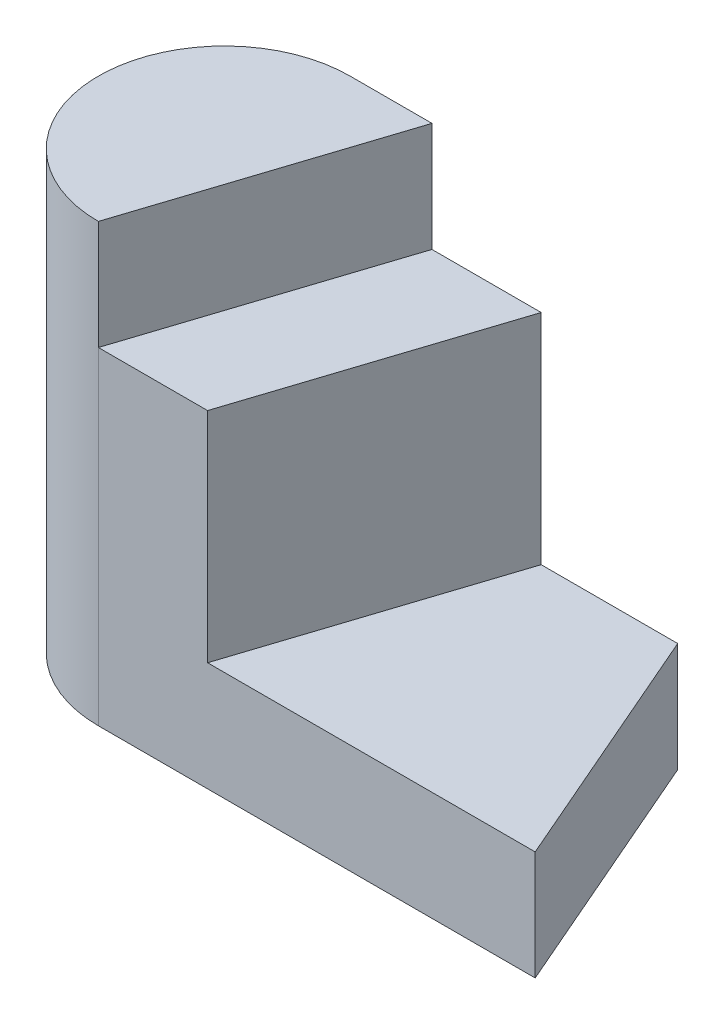
ISO-10303-21;
HEADER;
FILE_DESCRIPTION(('STEP AP214'),'2;1');
FILE_NAME('part.step','',(''),(''),'','','');
FILE_SCHEMA(('AUTOMOTIVE_DESIGN { 1 0 10303 214 1 1 1 1 }'));
ENDSEC;
DATA;
#1=APPLICATION_CONTEXT('core data for automotive mechanical design processes');
#2=APPLICATION_PROTOCOL_DEFINITION('international standard','automotive_design',2000,#1);
#3=PRODUCT_CONTEXT('',#1,'mechanical');
#4=PRODUCT('Part','Part','',(#3));
#5=PRODUCT_RELATED_PRODUCT_CATEGORY('part','',(#4));
#6=PRODUCT_DEFINITION_FORMATION('','',#4);
#7=PRODUCT_DEFINITION_CONTEXT('part definition',#1,'design');
#8=PRODUCT_DEFINITION('design','',#6,#7);
#9=PRODUCT_DEFINITION_SHAPE('','',#8);
#10=(LENGTH_UNIT() NAMED_UNIT(*) SI_UNIT(.MILLI.,.METRE.));
#11=(NAMED_UNIT(*) PLANE_ANGLE_UNIT() SI_UNIT($,.RADIAN.));
#12=(NAMED_UNIT(*) SI_UNIT($,.STERADIAN.) SOLID_ANGLE_UNIT());
#13=UNCERTAINTY_MEASURE_WITH_UNIT(LENGTH_MEASURE(1.E-05),#10,'distance_accuracy_value','');
#14=(GEOMETRIC_REPRESENTATION_CONTEXT(3) GLOBAL_UNCERTAINTY_ASSIGNED_CONTEXT((#13)) GLOBAL_UNIT_ASSIGNED_CONTEXT((#10,
#11,#12)) REPRESENTATION_CONTEXT('',''));
#15=CARTESIAN_POINT('',(0.,0.,0.));
#16=DIRECTION('',(0.,0.,1.));
#17=DIRECTION('',(1.,0.,0.));
#18=AXIS2_PLACEMENT_3D('',#15,#16,#17);
#19=CARTESIAN_POINT('',(0.,10.,0.));
#20=DIRECTION('',(0.,1.,0.));
#21=DIRECTION('',(0.,0.,1.));
#22=AXIS2_PLACEMENT_3D('',#19,#20,#21);
#23=PLANE('',#22);
#24=DIRECTION('',(-1.,0.,0.));
#25=VECTOR('',#24,1.);
#26=CARTESIAN_POINT('',(0.,10.,-11.5256491303152));
#27=LINE('',#26,#25);
#28=CARTESIAN_POINT('',(30.,10.,-11.5256491303152));
#29=VERTEX_POINT('',#28);
#30=CARTESIAN_POINT('',(17.4985474343053,10.,-11.5256491303152));
#31=VERTEX_POINT('',#30);
#32=EDGE_CURVE('E55',#29,#31,#27,.T.);
#33=ORIENTED_EDGE('',*,*,#32,.T.);
#34=DIRECTION('',(-0.309342603403961,0.,0.950950657878346));
#35=VECTOR('',#34,1.);
#36=CARTESIAN_POINT('',(17.4985474343053,10.,-11.5256491303152));
#37=LINE('',#36,#35);
#38=CARTESIAN_POINT('',(10.,10.,11.5256491303152));
#39=VERTEX_POINT('',#38);
#40=EDGE_CURVE('E60',#31,#39,#37,.T.);
#41=ORIENTED_EDGE('',*,*,#40,.T.);
#42=DIRECTION('',(1.,0.,0.));
#43=VECTOR('',#42,1.);
#44=CARTESIAN_POINT('',(0.,10.,11.5256491303152));
#45=LINE('',#44,#43);
#46=CARTESIAN_POINT('',(40.,10.,11.5256491303152));
#47=VERTEX_POINT('',#46);
#48=EDGE_CURVE('E156',#39,#47,#45,.T.);
#49=ORIENTED_EDGE('',*,*,#48,.T.);
#50=DIRECTION('',(-0.397979460955092,0.,-0.917394325608075));
#51=VECTOR('',#50,1.);
#52=CARTESIAN_POINT('',(30.,10.,-11.5256491303152));
#53=LINE('',#52,#51);
#54=EDGE_CURVE('E159',#47,#29,#53,.T.);
#55=ORIENTED_EDGE('',*,*,#54,.T.);
#56=EDGE_LOOP('',(#33,#41,#49,#55));
#57=FACE_BOUND('',#56,.T.);
#58=ADVANCED_FACE('F39',(#57),#23,.T.);
#59=CARTESIAN_POINT('',(0.,10.,0.));
#60=DIRECTION('',(0.,-1.,0.));
#61=DIRECTION('',(0.,0.,-1.));
#62=AXIS2_PLACEMENT_3D('',#59,#60,#61);
#63=CYLINDRICAL_SURFACE('',#62,11.5256491303152);
#64=CARTESIAN_POINT('',(0.,0.,0.));
#65=DIRECTION('',(0.,1.,0.));
#66=DIRECTION('',(0.,0.,1.));
#67=AXIS2_PLACEMENT_3D('',#64,#65,#66);
#68=CIRCLE('',#67,11.5256491303152);
#69=CARTESIAN_POINT('',(0.,0.,-11.5256491303152));
#70=VERTEX_POINT('',#69);
#71=CARTESIAN_POINT('',(0.,0.,11.5256491303152));
#72=VERTEX_POINT('',#71);
#73=EDGE_CURVE('E153',#70,#72,#68,.T.);
#74=ORIENTED_EDGE('',*,*,#73,.T.);
#75=DIRECTION('',(0.,-1.,0.));
#76=VECTOR('',#75,1.);
#77=CARTESIAN_POINT('',(0.,10.,11.5256491303152));
#78=LINE('',#77,#76);
#79=CARTESIAN_POINT('',(1.20724766569647E-13,30.,11.5256491303152));
#80=VERTEX_POINT('',#79);
#81=EDGE_CURVE('E11',#80,#72,#78,.T.);
#82=ORIENTED_EDGE('',*,*,#81,.F.);
#83=DIRECTION('',(0.,-1.,0.));
#84=VECTOR('',#83,1.);
#85=CARTESIAN_POINT('',(0.,40.,11.5256491303152));
#86=LINE('',#85,#84);
#87=CARTESIAN_POINT('',(0.,40.,11.5256491303152));
#88=VERTEX_POINT('',#87);
#89=EDGE_CURVE('E113',#88,#80,#86,.T.);
#90=ORIENTED_EDGE('',*,*,#89,.F.);
#91=CARTESIAN_POINT('',(0.,40.,0.));
#92=DIRECTION('',(0.,1.,0.));
#93=DIRECTION('',(0.,0.,1.));
#94=AXIS2_PLACEMENT_3D('',#91,#92,#93);
#95=CIRCLE('',#94,11.5256491303152);
#96=CARTESIAN_POINT('',(0.,40.,-11.5256491303152));
#97=VERTEX_POINT('',#96);
#98=EDGE_CURVE('E114',#97,#88,#95,.T.);
#99=ORIENTED_EDGE('',*,*,#98,.F.);
#100=DIRECTION('',(0.,-1.,0.));
#101=VECTOR('',#100,1.);
#102=CARTESIAN_POINT('',(0.,10.,-11.5256491303152));
#103=LINE('',#102,#101);
#104=EDGE_CURVE('E126',#97,#70,#103,.T.);
#105=ORIENTED_EDGE('',*,*,#104,.T.);
#106=EDGE_LOOP('',(#74,#82,#90,#99,#105));
#107=FACE_BOUND('',#106,.T.);
#108=ADVANCED_FACE('F41',(#107),#63,.T.);
#109=CARTESIAN_POINT('',(0.,10.,11.5256491303152));
#110=DIRECTION('',(0.,0.,-1.));
#111=DIRECTION('',(-1.,0.,0.));
#112=AXIS2_PLACEMENT_3D('',#109,#110,#111);
#113=PLANE('',#112);
#114=DIRECTION('',(1.,0.,0.));
#115=VECTOR('',#114,1.);
#116=CARTESIAN_POINT('',(0.,0.,11.5256491303152));
#117=LINE('',#116,#115);
#118=CARTESIAN_POINT('',(40.,0.,11.5256491303152));
#119=VERTEX_POINT('',#118);
#120=EDGE_CURVE('E168',#72,#119,#117,.T.);
#121=ORIENTED_EDGE('',*,*,#120,.T.);
#122=DIRECTION('',(0.,-1.,0.));
#123=VECTOR('',#122,1.);
#124=CARTESIAN_POINT('',(40.,10.,11.5256491303152));
#125=LINE('',#124,#123);
#126=EDGE_CURVE('E48',#47,#119,#125,.T.);
#127=ORIENTED_EDGE('',*,*,#126,.F.);
#128=ORIENTED_EDGE('',*,*,#48,.F.);
#129=DIRECTION('',(0.,-1.,0.));
#130=VECTOR('',#129,1.);
#131=CARTESIAN_POINT('',(10.,30.,11.5256491303152));
#132=LINE('',#131,#130);
#133=CARTESIAN_POINT('',(10.,30.,11.5256491303152));
#134=VERTEX_POINT('',#133);
#135=EDGE_CURVE('E149',#134,#39,#132,.T.);
#136=ORIENTED_EDGE('',*,*,#135,.F.);
#137=DIRECTION('',(1.,0.,0.));
#138=VECTOR('',#137,1.);
#139=CARTESIAN_POINT('',(1.20724766569647E-13,30.,11.5256491303152));
#140=LINE('',#139,#138);
#141=EDGE_CURVE('E141',#80,#134,#140,.T.);
#142=ORIENTED_EDGE('',*,*,#141,.F.);
#143=ORIENTED_EDGE('',*,*,#81,.T.);
#144=EDGE_LOOP('',(#121,#127,#128,#136,#142,#143));
#145=FACE_BOUND('',#144,.T.);
#146=ADVANCED_FACE('F200',(#145),#113,.F.);
#147=CARTESIAN_POINT('',(30.,10.,-11.5256491303152));
#148=DIRECTION('',(-0.917394325608075,0.,0.397979460955092));
#149=DIRECTION('',(0.397979460955092,0.,0.917394325608075));
#150=AXIS2_PLACEMENT_3D('',#147,#148,#149);
#151=PLANE('',#150);
#152=DIRECTION('',(-0.397979460955092,0.,-0.917394325608075));
#153=VECTOR('',#152,1.);
#154=CARTESIAN_POINT('',(30.,0.,-11.5256491303152));
#155=LINE('',#154,#153);
#156=CARTESIAN_POINT('',(30.,0.,-11.5256491303152));
#157=VERTEX_POINT('',#156);
#158=EDGE_CURVE('E171',#119,#157,#155,.T.);
#159=ORIENTED_EDGE('',*,*,#158,.T.);
#160=DIRECTION('',(0.,-1.,0.));
#161=VECTOR('',#160,1.);
#162=CARTESIAN_POINT('',(30.,10.,-11.5256491303152));
#163=LINE('',#162,#161);
#164=EDGE_CURVE('E178',#29,#157,#163,.T.);
#165=ORIENTED_EDGE('',*,*,#164,.F.);
#166=ORIENTED_EDGE('',*,*,#54,.F.);
#167=ORIENTED_EDGE('',*,*,#126,.T.);
#168=EDGE_LOOP('',(#159,#165,#166,#167));
#169=FACE_BOUND('',#168,.T.);
#170=ADVANCED_FACE('F187',(#169),#151,.F.);
#171=CARTESIAN_POINT('',(0.,10.,-11.5256491303152));
#172=DIRECTION('',(0.,0.,1.));
#173=DIRECTION('',(1.,0.,0.));
#174=AXIS2_PLACEMENT_3D('',#171,#172,#173);
#175=PLANE('',#174);
#176=ORIENTED_EDGE('',*,*,#104,.F.);
#177=DIRECTION('',(1.,0.,0.));
#178=VECTOR('',#177,1.);
#179=CARTESIAN_POINT('',(0.,40.,-11.5256491303152));
#180=LINE('',#179,#178);
#181=CARTESIAN_POINT('',(7.49854743430533,40.,-11.5256491303152));
#182=VERTEX_POINT('',#181);
#183=EDGE_CURVE('E119',#97,#182,#180,.T.);
#184=ORIENTED_EDGE('',*,*,#183,.T.);
#185=DIRECTION('',(0.,-1.,0.));
#186=VECTOR('',#185,1.);
#187=CARTESIAN_POINT('',(7.49854743430533,40.,-11.5256491303152));
#188=LINE('',#187,#186);
#189=CARTESIAN_POINT('',(7.49854743430533,30.,-11.5256491303152));
#190=VERTEX_POINT('',#189);
#191=EDGE_CURVE('E101',#182,#190,#188,.T.);
#192=ORIENTED_EDGE('',*,*,#191,.T.);
#193=DIRECTION('',(1.,0.,0.));
#194=VECTOR('',#193,1.);
#195=CARTESIAN_POINT('',(7.49854743430533,30.,-11.5256491303152));
#196=LINE('',#195,#194);
#197=CARTESIAN_POINT('',(17.4985474343053,30.,-11.5256491303152));
#198=VERTEX_POINT('',#197);
#199=EDGE_CURVE('E134',#190,#198,#196,.T.);
#200=ORIENTED_EDGE('',*,*,#199,.T.);
#201=DIRECTION('',(0.,-1.,0.));
#202=VECTOR('',#201,1.);
#203=CARTESIAN_POINT('',(17.4985474343053,30.,-11.5256491303152));
#204=LINE('',#203,#202);
#205=EDGE_CURVE('E146',#198,#31,#204,.T.);
#206=ORIENTED_EDGE('',*,*,#205,.T.);
#207=ORIENTED_EDGE('',*,*,#32,.F.);
#208=ORIENTED_EDGE('',*,*,#164,.T.);
#209=DIRECTION('',(-1.,0.,0.));
#210=VECTOR('',#209,1.);
#211=CARTESIAN_POINT('',(0.,0.,-11.5256491303152));
#212=LINE('',#211,#210);
#213=EDGE_CURVE('E160',#157,#70,#212,.T.);
#214=ORIENTED_EDGE('',*,*,#213,.T.);
#215=EDGE_LOOP('',(#176,#184,#192,#200,#206,#207,#208,#214));
#216=FACE_BOUND('',#215,.T.);
#217=ADVANCED_FACE('F124',(#216),#175,.F.);
#218=CARTESIAN_POINT('',(0.,0.,0.));
#219=DIRECTION('',(0.,1.,0.));
#220=DIRECTION('',(0.,0.,1.));
#221=AXIS2_PLACEMENT_3D('',#218,#219,#220);
#222=PLANE('',#221);
#223=ORIENTED_EDGE('',*,*,#73,.F.);
#224=ORIENTED_EDGE('',*,*,#213,.F.);
#225=ORIENTED_EDGE('',*,*,#158,.F.);
#226=ORIENTED_EDGE('',*,*,#120,.F.);
#227=EDGE_LOOP('',(#223,#224,#225,#226));
#228=FACE_BOUND('',#227,.T.);
#229=ADVANCED_FACE('F193',(#228),#222,.F.);
#230=CARTESIAN_POINT('',(17.4985474343053,30.,-11.5256491303152));
#231=DIRECTION('',(0.950950657878346,0.,0.309342603403961));
#232=DIRECTION('',(0.309342603403961,0.,-0.950950657878346));
#233=AXIS2_PLACEMENT_3D('',#230,#231,#232);
#234=PLANE('',#233);
#235=ORIENTED_EDGE('',*,*,#40,.F.);
#236=ORIENTED_EDGE('',*,*,#205,.F.);
#237=DIRECTION('',(-0.309342603403961,0.,0.950950657878346));
#238=VECTOR('',#237,1.);
#239=CARTESIAN_POINT('',(17.4985474343053,30.,-11.5256491303152));
#240=LINE('',#239,#238);
#241=EDGE_CURVE('E137',#198,#134,#240,.T.);
#242=ORIENTED_EDGE('',*,*,#241,.T.);
#243=ORIENTED_EDGE('',*,*,#135,.T.);
#244=EDGE_LOOP('',(#235,#236,#242,#243));
#245=FACE_BOUND('',#244,.T.);
#246=ADVANCED_FACE('F202',(#245),#234,.T.);
#247=CARTESIAN_POINT('',(0.,30.,0.));
#248=DIRECTION('',(0.,-1.,0.));
#249=DIRECTION('',(0.,0.,-1.));
#250=AXIS2_PLACEMENT_3D('',#247,#248,#249);
#251=PLANE('',#250);
#252=ORIENTED_EDGE('',*,*,#199,.F.);
#253=DIRECTION('',(-0.309342603403957,0.,0.950950657878348));
#254=VECTOR('',#253,1.);
#255=CARTESIAN_POINT('',(7.49854743430533,30.,-11.5256491303152));
#256=LINE('',#255,#254);
#257=EDGE_CURVE('E107',#190,#80,#256,.T.);
#258=ORIENTED_EDGE('',*,*,#257,.T.);
#259=ORIENTED_EDGE('',*,*,#141,.T.);
#260=ORIENTED_EDGE('',*,*,#241,.F.);
#261=EDGE_LOOP('',(#252,#258,#259,#260));
#262=FACE_BOUND('',#261,.T.);
#263=ADVANCED_FACE('F197',(#262),#251,.F.);
#264=CARTESIAN_POINT('',(7.49854743430533,40.,-11.5256491303152));
#265=DIRECTION('',(0.950950657878348,0.,0.309342603403957));
#266=DIRECTION('',(0.309342603403957,0.,-0.950950657878348));
#267=AXIS2_PLACEMENT_3D('',#264,#265,#266);
#268=PLANE('',#267);
#269=ORIENTED_EDGE('',*,*,#257,.F.);
#270=ORIENTED_EDGE('',*,*,#191,.F.);
#271=DIRECTION('',(-0.309342603403957,0.,0.950950657878348));
#272=VECTOR('',#271,1.);
#273=CARTESIAN_POINT('',(7.49854743430533,40.,-11.5256491303152));
#274=LINE('',#273,#272);
#275=EDGE_CURVE('E105',#182,#88,#274,.T.);
#276=ORIENTED_EDGE('',*,*,#275,.T.);
#277=ORIENTED_EDGE('',*,*,#89,.T.);
#278=EDGE_LOOP('',(#269,#270,#276,#277));
#279=FACE_BOUND('',#278,.T.);
#280=ADVANCED_FACE('F103',(#279),#268,.T.);
#281=CARTESIAN_POINT('',(0.,40.,0.));
#282=DIRECTION('',(0.,1.,0.));
#283=DIRECTION('',(0.,0.,1.));
#284=AXIS2_PLACEMENT_3D('',#281,#282,#283);
#285=PLANE('',#284);
#286=ORIENTED_EDGE('',*,*,#183,.F.);
#287=ORIENTED_EDGE('',*,*,#98,.T.);
#288=ORIENTED_EDGE('',*,*,#275,.F.);
#289=EDGE_LOOP('',(#286,#287,#288));
#290=FACE_BOUND('',#289,.T.);
#291=ADVANCED_FACE('F118',(#290),#285,.T.);
#292=CLOSED_SHELL('',(#58,#108,#146,#170,#217,#229,#246,#263,#280,#291));
#293=MANIFOLD_SOLID_BREP('B2',#292);
#294=ADVANCED_BREP_SHAPE_REPRESENTATION('',(#18,#293),#14);
#295=SHAPE_DEFINITION_REPRESENTATION(#9,#294);
ENDSEC;
END-ISO-10303-21;
